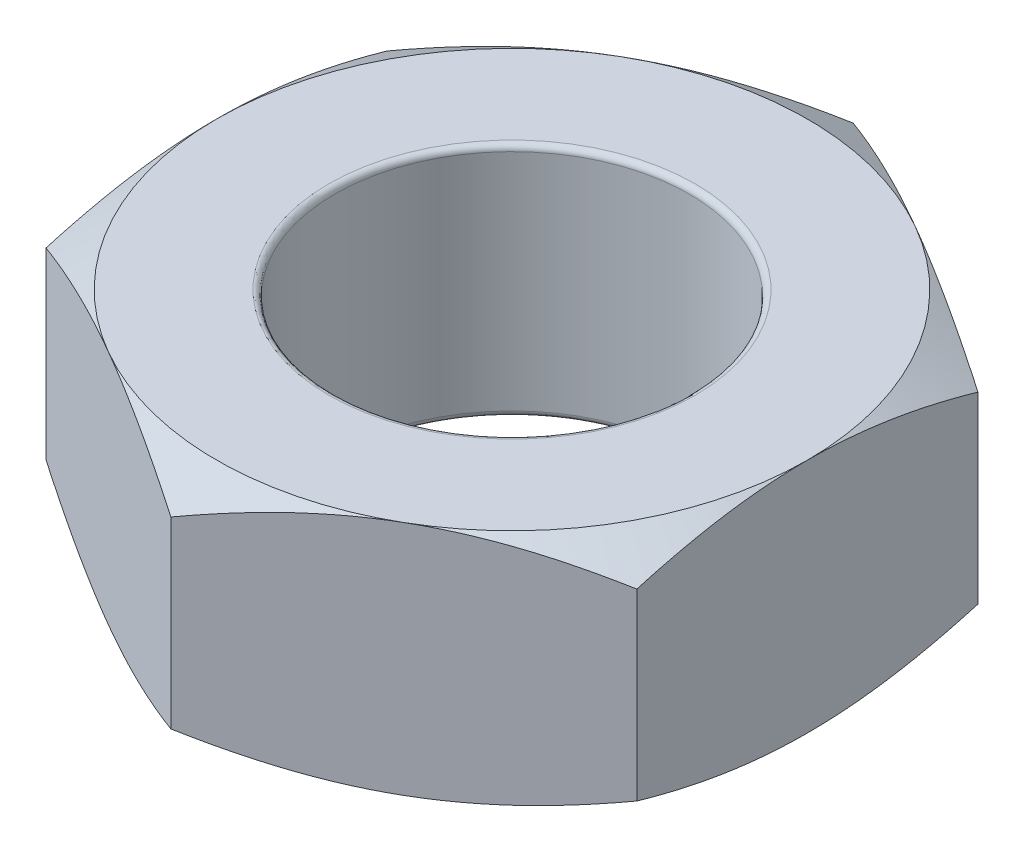
ISO-10303-21;
HEADER;
FILE_DESCRIPTION(('STEP AP214'),'2;1');
FILE_NAME('part.step','',(''),(''),'','','');
FILE_SCHEMA(('AUTOMOTIVE_DESIGN { 1 0 10303 214 1 1 1 1 }'));
ENDSEC;
DATA;
#1=APPLICATION_CONTEXT('core data for automotive mechanical design processes');
#2=APPLICATION_PROTOCOL_DEFINITION('international standard','automotive_design',2000,#1);
#3=PRODUCT_CONTEXT('',#1,'mechanical');
#4=PRODUCT('Part','Part','',(#3));
#5=PRODUCT_RELATED_PRODUCT_CATEGORY('part','',(#4));
#6=PRODUCT_DEFINITION_FORMATION('','',#4);
#7=PRODUCT_DEFINITION_CONTEXT('part definition',#1,'design');
#8=PRODUCT_DEFINITION('design','',#6,#7);
#9=PRODUCT_DEFINITION_SHAPE('','',#8);
#10=(LENGTH_UNIT() NAMED_UNIT(*) SI_UNIT(.MILLI.,.METRE.));
#11=(NAMED_UNIT(*) PLANE_ANGLE_UNIT() SI_UNIT($,.RADIAN.));
#12=(NAMED_UNIT(*) SI_UNIT($,.STERADIAN.) SOLID_ANGLE_UNIT());
#13=UNCERTAINTY_MEASURE_WITH_UNIT(LENGTH_MEASURE(1.E-05),#10,'distance_accuracy_value','');
#14=(GEOMETRIC_REPRESENTATION_CONTEXT(3) GLOBAL_UNCERTAINTY_ASSIGNED_CONTEXT((#13)) GLOBAL_UNIT_ASSIGNED_CONTEXT((#10,
#11,#12)) REPRESENTATION_CONTEXT('',''));
#15=CARTESIAN_POINT('',(0.,0.,0.));
#16=DIRECTION('',(0.,0.,1.));
#17=DIRECTION('',(1.,0.,0.));
#18=AXIS2_PLACEMENT_3D('',#15,#16,#17);
#19=CARTESIAN_POINT('',(2.5,2.,-1.44337567297407));
#20=DIRECTION('',(-0.5,0.,0.866025403784439));
#21=DIRECTION('',(0.866025403784439,0.,0.5));
#22=AXIS2_PLACEMENT_3D('',#19,#20,#21);
#23=PLANE('',#22);
#24=CARTESIAN_POINT('',(-0.000200000000000972,0.223357664359108,-2.88686681600197));
#25=CARTESIAN_POINT('',(0.10966323473487,0.186721620107626,-2.82343724785375));
#26=CARTESIAN_POINT('',(0.220474799896525,0.153402218965056,-2.75946016087834));
#27=CARTESIAN_POINT('',(0.444016833466049,0.0952422855578577,-2.63039810762178));
#28=CARTESIAN_POINT('',(0.556751274528388,0.0704223291477383,-2.5653108477275));
#29=CARTESIAN_POINT('',(0.780822993875268,0.0317856514410521,-2.43594298024479));
#30=CARTESIAN_POINT('',(0.892125791767376,0.017711796185639,-2.37168227992023));
#31=CARTESIAN_POINT('',(1.11525522746833,0.000909152352750347,-2.24285844015415));
#32=CARTESIAN_POINT('',(1.22708105401423,-0.00183354879637327,-2.17829576909553));
#33=CARTESIAN_POINT('',(1.43604197555152,0.00386576000805357,-2.05765212479586));
#34=CARTESIAN_POINT('',(1.53320831755773,0.0109083943818617,-2.0015531110824));
#35=CARTESIAN_POINT('',(1.726907949711,0.0332314191249425,-1.88972057631678));
#36=CARTESIAN_POINT('',(1.82344056965973,0.0485194384402671,-1.8339874422038));
#37=CARTESIAN_POINT('',(2.01753972174048,0.0867390938444202,-1.7219242445005));
#38=CARTESIAN_POINT('',(2.11508168178214,0.109832776125517,-1.66560836761317));
#39=CARTESIAN_POINT('',(2.30871060807608,0.162246656577913,-1.55381665489446));
#40=CARTESIAN_POINT('',(2.40480005588618,0.191554535624548,-1.49833938633502));
#41=CARTESIAN_POINT('',(2.5002,0.223357664359108,-1.44326020292023));
#42=B_SPLINE_CURVE_WITH_KNOTS('',3,(#24,#25,#26,#27,#28,#29,#30,#31,#32,#33,#34,#35,#36,#37,#38,
#39,#40,#41),.UNSPECIFIED.,.F.,.F.,(4,2,2,2,2,2,2,2,4),(0.,0.396285827362227,0.793524330152051,
1.18093086852114,1.56786160134475,1.90479741793733,2.24204551660463,2.58677531536756,
2.93082800105256),.UNSPECIFIED.);
#43=CARTESIAN_POINT('',(0.,0.223290993692601,-2.88675134594813));
#44=VERTEX_POINT('',#43);
#45=CARTESIAN_POINT('',(1.25,0.,-2.1650635094611));
#46=VERTEX_POINT('',#45);
#47=EDGE_CURVE('E63',#44,#46,#42,.T.);
#48=ORIENTED_EDGE('',*,*,#47,.F.);
#49=DIRECTION('',(0.,-1.,0.));
#50=VECTOR('',#49,1.);
#51=CARTESIAN_POINT('',(0.,2.,-2.88675134594813));
#52=LINE('',#51,#50);
#53=CARTESIAN_POINT('',(0.,1.7767090063074,-2.88675134594813));
#54=VERTEX_POINT('',#53);
#55=EDGE_CURVE('E346',#54,#44,#52,.T.);
#56=ORIENTED_EDGE('',*,*,#55,.F.);
#57=CARTESIAN_POINT('',(2.5002,1.77664233564089,-1.44326020292023));
#58=CARTESIAN_POINT('',(2.39033676526513,1.81327837989237,-1.50668977106845));
#59=CARTESIAN_POINT('',(2.27952520010347,1.84659778103494,-1.57066685804385));
#60=CARTESIAN_POINT('',(2.05598316653395,1.90475771444214,-1.69972891130041));
#61=CARTESIAN_POINT('',(1.94324872547161,1.92957767085226,-1.7648161711947));
#62=CARTESIAN_POINT('',(1.71917700612473,1.96821434855895,-1.8941840386774));
#63=CARTESIAN_POINT('',(1.60787420823262,1.98228820381436,-1.95844473900197));
#64=CARTESIAN_POINT('',(1.38474477253167,1.99909084764725,-2.08726857876805));
#65=CARTESIAN_POINT('',(1.27291894598577,2.00183354879637,-2.15183124982667));
#66=CARTESIAN_POINT('',(1.06395802444848,1.99613423999195,-2.27247489412634));
#67=CARTESIAN_POINT('',(0.966791682442268,1.98909160561814,-2.32857390783979));
#68=CARTESIAN_POINT('',(0.773092050288997,1.96676858087506,-2.44040644260542));
#69=CARTESIAN_POINT('',(0.676559430340267,1.95148056155973,-2.4961395767184));
#70=CARTESIAN_POINT('',(0.482460278259523,1.91326090615558,-2.60820277442169));
#71=CARTESIAN_POINT('',(0.384918318217859,1.89016722387448,-2.66451865130903));
#72=CARTESIAN_POINT('',(0.191289391923914,1.83775334342209,-2.77631036402774));
#73=CARTESIAN_POINT('',(0.0951999441138233,1.80844546437545,-2.83178763258718));
#74=CARTESIAN_POINT('',(-0.000200000000001035,1.77664233564089,-2.88686681600197));
#75=B_SPLINE_CURVE_WITH_KNOTS('',3,(#57,#58,#59,#60,#61,#62,#63,#64,#65,#66,#67,#68,#69,#70,#71,
#72,#73,#74),.UNSPECIFIED.,.F.,.F.,(4,2,2,2,2,2,2,2,4),(0.,0.396285827362227,0.793524330152051,
1.18093086852114,1.56786160134475,1.90479741793733,2.24204551660463,2.58677531536756,
2.93082800105256),.UNSPECIFIED.);
#76=CARTESIAN_POINT('',(1.25,2.,-2.1650635094611));
#77=VERTEX_POINT('',#76);
#78=EDGE_CURVE('E278',#77,#54,#75,.T.);
#79=ORIENTED_EDGE('',*,*,#78,.F.);
#80=CARTESIAN_POINT('',(2.5,1.7767090063074,-1.44337567297408));
#81=VERTEX_POINT('',#80);
#82=EDGE_CURVE('E365',#81,#77,#75,.T.);
#83=ORIENTED_EDGE('',*,*,#82,.F.);
#84=DIRECTION('',(0.,-1.,0.));
#85=VECTOR('',#84,1.);
#86=CARTESIAN_POINT('',(2.5,2.,-1.44337567297407));
#87=LINE('',#86,#85);
#88=CARTESIAN_POINT('',(2.5,0.223290993692601,-1.44337567297407));
#89=VERTEX_POINT('',#88);
#90=EDGE_CURVE('E362',#81,#89,#87,.T.);
#91=ORIENTED_EDGE('',*,*,#90,.T.);
#92=EDGE_CURVE('E151',#46,#89,#42,.T.);
#93=ORIENTED_EDGE('',*,*,#92,.F.);
#94=EDGE_LOOP('',(#48,#56,#79,#83,#91,#93));
#95=FACE_BOUND('',#94,.T.);
#96=ADVANCED_FACE('F47',(#95),#23,.F.);
#97=CARTESIAN_POINT('',(0.,2.,-2.88675134594813));
#98=DIRECTION('',(0.5,0.,0.866025403784439));
#99=DIRECTION('',(0.866025403784439,0.,-0.5));
#100=AXIS2_PLACEMENT_3D('',#97,#98,#99);
#101=PLANE('',#100);
#102=CARTESIAN_POINT('',(-2.5002,0.223357664359108,-1.44326020292023));
#103=CARTESIAN_POINT('',(-2.39033676526513,0.186721620107626,-1.50668977106845));
#104=CARTESIAN_POINT('',(-2.27952520010347,0.153402218965056,-1.57066685804385));
#105=CARTESIAN_POINT('',(-2.05598316653395,0.0952422855578577,-1.69972891130041));
#106=CARTESIAN_POINT('',(-1.94324872547161,0.0704223291477382,-1.7648161711947));
#107=CARTESIAN_POINT('',(-1.71917700612473,0.031785651441052,-1.8941840386774));
#108=CARTESIAN_POINT('',(-1.60787420823262,0.0177117961856391,-1.95844473900197));
#109=CARTESIAN_POINT('',(-1.38474477253167,0.000909152352750374,-2.08726857876804));
#110=CARTESIAN_POINT('',(-1.27291894598577,-0.00183354879637335,-2.15183124982667));
#111=CARTESIAN_POINT('',(-1.06395802444848,0.00386576000805362,-2.27247489412634));
#112=CARTESIAN_POINT('',(-0.966791682442269,0.0109083943818619,-2.32857390783979));
#113=CARTESIAN_POINT('',(-0.773092050288998,0.0332314191249427,-2.44040644260542));
#114=CARTESIAN_POINT('',(-0.676559430340268,0.0485194384402672,-2.4961395767184));
#115=CARTESIAN_POINT('',(-0.482460278259525,0.0867390938444203,-2.60820277442169));
#116=CARTESIAN_POINT('',(-0.38491831821786,0.109832776125517,-2.66451865130903));
#117=CARTESIAN_POINT('',(-0.191289391923916,0.162246656577913,-2.77631036402774));
#118=CARTESIAN_POINT('',(-0.0951999441138251,0.191554535624548,-2.83178763258718));
#119=CARTESIAN_POINT('',(0.000199999999998792,0.223357664359108,-2.88686681600197));
#120=B_SPLINE_CURVE_WITH_KNOTS('',3,(#102,#103,#104,#105,#106,#107,#108,#109,#110,#111,#112,
#113,#114,#115,#116,#117,#118,#119),.UNSPECIFIED.,.F.,.F.,(4,2,2,2,2,2,2,2,4),(0.,
0.396285827362227,0.793524330152051,1.18093086852114,1.56786160134475,1.90479741793733,
2.24204551660463,2.58677531536756,2.93082800105256),.UNSPECIFIED.);
#121=CARTESIAN_POINT('',(-2.5,0.223290993692601,-1.44337567297406));
#122=VERTEX_POINT('',#121);
#123=CARTESIAN_POINT('',(-1.25,0.,-2.1650635094611));
#124=VERTEX_POINT('',#123);
#125=EDGE_CURVE('E71',#122,#124,#120,.T.);
#126=ORIENTED_EDGE('',*,*,#125,.F.);
#127=DIRECTION('',(0.,-1.,0.));
#128=VECTOR('',#127,1.);
#129=CARTESIAN_POINT('',(-2.5,2.,-1.44337567297406));
#130=LINE('',#129,#128);
#131=CARTESIAN_POINT('',(-2.5,1.7767090063074,-1.44337567297406));
#132=VERTEX_POINT('',#131);
#133=EDGE_CURVE('E350',#132,#122,#130,.T.);
#134=ORIENTED_EDGE('',*,*,#133,.F.);
#135=CARTESIAN_POINT('',(0.000199999999999193,1.77664233564089,-2.88686681600197));
#136=CARTESIAN_POINT('',(-0.109663234734872,1.81327837989237,-2.82343724785375));
#137=CARTESIAN_POINT('',(-0.220474799896526,1.84659778103494,-2.75946016087834));
#138=CARTESIAN_POINT('',(-0.44401683346605,1.90475771444214,-2.63039810762178));
#139=CARTESIAN_POINT('',(-0.556751274528389,1.92957767085226,-2.5653108477275));
#140=CARTESIAN_POINT('',(-0.780822993875269,1.96821434855895,-2.43594298024479));
#141=CARTESIAN_POINT('',(-0.892125791767378,1.98228820381436,-2.37168227992023));
#142=CARTESIAN_POINT('',(-1.11525522746833,1.99909084764725,-2.24285844015415));
#143=CARTESIAN_POINT('',(-1.22708105401423,2.00183354879637,-2.17829576909553));
#144=CARTESIAN_POINT('',(-1.43604197555152,1.99613423999195,-2.05765212479586));
#145=CARTESIAN_POINT('',(-1.53320831755773,1.98909160561814,-2.0015531110824));
#146=CARTESIAN_POINT('',(-1.726907949711,1.96676858087506,-1.88972057631678));
#147=CARTESIAN_POINT('',(-1.82344056965973,1.95148056155973,-1.8339874422038));
#148=CARTESIAN_POINT('',(-2.01753972174048,1.91326090615558,-1.7219242445005));
#149=CARTESIAN_POINT('',(-2.11508168178214,1.89016722387448,-1.66560836761316));
#150=CARTESIAN_POINT('',(-2.30871060807609,1.83775334342209,-1.55381665489446));
#151=CARTESIAN_POINT('',(-2.40480005588618,1.80844546437545,-1.49833938633502));
#152=CARTESIAN_POINT('',(-2.5002,1.77664233564089,-1.44326020292023));
#153=B_SPLINE_CURVE_WITH_KNOTS('',3,(#135,#136,#137,#138,#139,#140,#141,#142,#143,#144,#145,
#146,#147,#148,#149,#150,#151,#152),.UNSPECIFIED.,.F.,.F.,(4,2,2,2,2,2,2,2,4),(0.,
0.396285827362227,0.793524330152051,1.18093086852114,1.56786160134475,1.90479741793733,
2.24204551660463,2.58677531536756,2.93082800105256),.UNSPECIFIED.);
#154=CARTESIAN_POINT('',(-1.25,2.,-2.1650635094611));
#155=VERTEX_POINT('',#154);
#156=EDGE_CURVE('E270',#155,#132,#153,.T.);
#157=ORIENTED_EDGE('',*,*,#156,.F.);
#158=EDGE_CURVE('E277',#54,#155,#153,.T.);
#159=ORIENTED_EDGE('',*,*,#158,.F.);
#160=ORIENTED_EDGE('',*,*,#55,.T.);
#161=EDGE_CURVE('E183',#124,#44,#120,.T.);
#162=ORIENTED_EDGE('',*,*,#161,.F.);
#163=EDGE_LOOP('',(#126,#134,#157,#159,#160,#162));
#164=FACE_BOUND('',#163,.T.);
#165=ADVANCED_FACE('F284',(#164),#101,.F.);
#166=CARTESIAN_POINT('',(-2.5,2.,-1.44337567297406));
#167=DIRECTION('',(1.,0.,0.));
#168=DIRECTION('',(0.,0.,-1.));
#169=AXIS2_PLACEMENT_3D('',#166,#167,#168);
#170=PLANE('',#169);
#171=CARTESIAN_POINT('',(-2.5,1.75051746805577,4.93486171933444));
#172=CARTESIAN_POINT('',(-2.5,1.69133726261722,4.8199403481942));
#173=CARTESIAN_POINT('',(-2.5,1.63247825676005,4.70485212642124));
#174=CARTESIAN_POINT('',(-2.5,1.51556406119456,4.47426567976795));
#175=CARTESIAN_POINT('',(-2.5,1.45750888635444,4.3587674473533));
#176=CARTESIAN_POINT('',(-2.5,1.34227244134488,4.12710089531368));
#177=CARTESIAN_POINT('',(-2.5,1.28509274407798,4.01093179192169));
#178=CARTESIAN_POINT('',(-2.5,1.17192590701674,3.77801122649482));
#179=CARTESIAN_POINT('',(-2.5,1.11593878415348,3.66125975622101));
#180=CARTESIAN_POINT('',(-2.5,1.00253157682963,3.42088300849687));
#181=CARTESIAN_POINT('',(-2.5,0.945191561608959,3.2972198482005));
#182=CARTESIAN_POINT('',(-2.5,0.832598686179216,3.04894788037271));
#183=CARTESIAN_POINT('',(-2.5,0.777345769924556,2.92433909834247));
#184=CARTESIAN_POINT('',(-2.5,0.669564709168184,2.67404231382757));
#185=CARTESIAN_POINT('',(-2.5,0.617034744165751,2.54835509963059));
#186=CARTESIAN_POINT('',(-2.5,0.515470603951829,2.29553518807958));
#187=CARTESIAN_POINT('',(-2.5,0.466437240853758,2.16840216282304));
#188=CARTESIAN_POINT('',(-2.5,0.36551904558916,1.89196933857389));
#189=CARTESIAN_POINT('',(-2.5,0.314430928565565,1.74237414052598));
#190=CARTESIAN_POINT('',(-2.5,0.220856049236355,1.4405551511059));
#191=CARTESIAN_POINT('',(-2.5,0.178364945289853,1.28833272889575));
#192=CARTESIAN_POINT('',(-2.5,0.105752289587979,0.983942199808397));
#193=CARTESIAN_POINT('',(-2.5,0.075408967281811,0.831829132495784));
#194=CARTESIAN_POINT('',(-2.5,0.0406516796303217,0.602071425625844));
#195=CARTESIAN_POINT('',(-2.5,0.0308592992319912,0.525228449493818));
#196=CARTESIAN_POINT('',(-2.5,0.0151636656794685,0.371150643177173));
#197=CARTESIAN_POINT('',(-2.5,0.00925981943211505,0.293915874561849));
#198=CARTESIAN_POINT('',(-2.5,0.00149945618362679,0.13817730801555));
#199=CARTESIAN_POINT('',(-2.5,-0.000300329680072579,0.0596706558577329));
#200=CARTESIAN_POINT('',(-2.5,0.000382182470508818,-0.0973237037747563));
#201=CARTESIAN_POINT('',(-2.5,0.00286448024898971,-0.175811411250471));
#202=CARTESIAN_POINT('',(-2.5,0.0120180751018743,-0.33255646239666));
#203=CARTESIAN_POINT('',(-2.5,0.0186902391546219,-0.4108137550211));
#204=CARTESIAN_POINT('',(-2.5,0.0359818737124383,-0.566895759516455));
#205=CARTESIAN_POINT('',(-2.5,0.0466019878865535,-0.644720398746936));
#206=CARTESIAN_POINT('',(-2.5,0.0843776540425921,-0.880425277323258));
#207=CARTESIAN_POINT('',(-2.5,0.117244290445989,-1.0374021276822));
#208=CARTESIAN_POINT('',(-2.5,0.194551132550417,-1.34841101742391));
#209=CARTESIAN_POINT('',(-2.5,0.238994974726619,-1.50244211517955));
#210=CARTESIAN_POINT('',(-2.5,0.334467726657707,-1.80198948227857));
#211=CARTESIAN_POINT('',(-2.5,0.385183371784437,-1.94760725909514));
#212=CARTESIAN_POINT('',(-2.5,0.492317846941426,-2.23674360042291));
#213=CARTESIAN_POINT('',(-2.5,0.548738075330582,-2.38026164031034));
#214=CARTESIAN_POINT('',(-2.5,0.665809108984892,-2.66572180096044));
#215=CARTESIAN_POINT('',(-2.5,0.726464237701915,-2.80766213451906));
#216=CARTESIAN_POINT('',(-2.5,0.850881769521233,-3.0901760741915));
#217=CARTESIAN_POINT('',(-2.5,0.914644342755144,-3.23074960496675));
#218=CARTESIAN_POINT('',(-2.5,1.04081855009125,-3.50283338488747));
#219=CARTESIAN_POINT('',(-2.5,1.10310046173394,-3.63440403331771));
#220=CARTESIAN_POINT('',(-2.5,1.2292955254876,-3.89676431270018));
#221=CARTESIAN_POINT('',(-2.5,1.29320873128699,-4.02755391777179));
#222=CARTESIAN_POINT('',(-2.5,1.42210820195559,-4.28806433847913));
#223=CARTESIAN_POINT('',(-2.5,1.48709022600769,-4.41778725733018));
#224=CARTESIAN_POINT('',(-2.5,1.61808743263322,-4.67669676330922));
#225=CARTESIAN_POINT('',(-2.5,1.68410252583257,-4.8058833956229));
#226=CARTESIAN_POINT('',(-2.5,1.75051746805577,-4.93486171933444));
#227=B_SPLINE_CURVE_WITH_KNOTS('',3,(#171,#172,#173,#174,#175,#176,#177,#178,#179,#180,#181,
#182,#183,#184,#185,#186,#187,#188,#189,#190,#191,#192,#193,#194,#195,#196,#197,#198,#199,#200,
#201,#202,#203,#204,#205,#206,#207,#208,#209,#210,#211,#212,#213,#214,#215,#216,#217,#218,#219,
#220,#221,#222,#223,#224,#225,#226),.UNSPECIFIED.,.F.,.F.,(4,2,2,2,2,2,2,2,2,2,2,2,2,2,2,2,2,2,
2,2,2,2,2,2,2,2,2,4),(0.,0.387793831894925,0.775594827128252,1.16402581850153,1.5524623207934,
1.96137758264064,2.37028185592793,2.77890912291195,3.1876309897647,3.66167496284643,
4.13547893462243,4.60018855861608,4.83249783003166,5.06477166059454,5.30023727903514,
5.53570288450944,5.77121722921933,6.00676998875775,6.48725754661897,6.96789621109928,
7.43032586595214,7.89286915182353,8.35589175957824,8.81893974621792,9.25562834373433,
9.69233133192937,10.1275921173417,10.5628154528867),.UNSPECIFIED.);
#228=CARTESIAN_POINT('',(-2.5,0.223290993692601,1.44337567297407));
#229=VERTEX_POINT('',#228);
#230=CARTESIAN_POINT('',(-2.5,0.,0.));
#231=VERTEX_POINT('',#230);
#232=EDGE_CURVE('E404',#229,#231,#227,.T.);
#233=ORIENTED_EDGE('',*,*,#232,.F.);
#234=DIRECTION('',(0.,-1.,0.));
#235=VECTOR('',#234,1.);
#236=CARTESIAN_POINT('',(-2.5,2.,1.44337567297407));
#237=LINE('',#236,#235);
#238=CARTESIAN_POINT('',(-2.5,1.7767090063074,1.44337567297407));
#239=VERTEX_POINT('',#238);
#240=EDGE_CURVE('E354',#239,#229,#237,.T.);
#241=ORIENTED_EDGE('',*,*,#240,.F.);
#242=CARTESIAN_POINT('',(-2.5,0.249482531944228,-4.93486171933444));
#243=CARTESIAN_POINT('',(-2.5,0.308662737382781,-4.8199403481942));
#244=CARTESIAN_POINT('',(-2.5,0.36752174323995,-4.70485212642124));
#245=CARTESIAN_POINT('',(-2.5,0.48443593880544,-4.47426567976795));
#246=CARTESIAN_POINT('',(-2.5,0.542491113645564,-4.3587674473533));
#247=CARTESIAN_POINT('',(-2.5,0.657727558655123,-4.12710089531368));
#248=CARTESIAN_POINT('',(-2.5,0.714907255922023,-4.01093179192169));
#249=CARTESIAN_POINT('',(-2.5,0.828074092983264,-3.77801122649482));
#250=CARTESIAN_POINT('',(-2.5,0.884061215846521,-3.66125975622101));
#251=CARTESIAN_POINT('',(-2.5,0.997468423170368,-3.42088300849687));
#252=CARTESIAN_POINT('',(-2.5,1.05480843839104,-3.2972198482005));
#253=CARTESIAN_POINT('',(-2.5,1.16740131382078,-3.04894788037271));
#254=CARTESIAN_POINT('',(-2.5,1.22265423007544,-2.92433909834247));
#255=CARTESIAN_POINT('',(-2.5,1.33043529083182,-2.67404231382757));
#256=CARTESIAN_POINT('',(-2.5,1.38296525583425,-2.54835509963059));
#257=CARTESIAN_POINT('',(-2.5,1.48452939604817,-2.29553518807957));
#258=CARTESIAN_POINT('',(-2.5,1.53356275914624,-2.16840216282304));
#259=CARTESIAN_POINT('',(-2.5,1.63448095441084,-1.89196933857388));
#260=CARTESIAN_POINT('',(-2.5,1.68556907143444,-1.74237414052597));
#261=CARTESIAN_POINT('',(-2.5,1.77914395076365,-1.4405551511059));
#262=CARTESIAN_POINT('',(-2.5,1.82163505471015,-1.28833272889575));
#263=CARTESIAN_POINT('',(-2.5,1.89424771041202,-0.983942199808394));
#264=CARTESIAN_POINT('',(-2.5,1.92459103271819,-0.831829132495781));
#265=CARTESIAN_POINT('',(-2.5,1.95934832036968,-0.602071425625841));
#266=CARTESIAN_POINT('',(-2.5,1.96914070076801,-0.525228449493815));
#267=CARTESIAN_POINT('',(-2.5,1.98483633432053,-0.371150643177171));
#268=CARTESIAN_POINT('',(-2.5,1.99074018056788,-0.293915874561847));
#269=CARTESIAN_POINT('',(-2.5,1.99850054381637,-0.138177308015548));
#270=CARTESIAN_POINT('',(-2.5,2.00030032968007,-0.0596706558577308));
#271=CARTESIAN_POINT('',(-2.5,1.99961781752949,0.0973237037747584));
#272=CARTESIAN_POINT('',(-2.5,1.99713551975101,0.175811411250473));
#273=CARTESIAN_POINT('',(-2.5,1.98798192489813,0.332556462396662));
#274=CARTESIAN_POINT('',(-2.5,1.98130976084538,0.410813755021102));
#275=CARTESIAN_POINT('',(-2.5,1.96401812628756,0.566895759516457));
#276=CARTESIAN_POINT('',(-2.5,1.95339801211345,0.644720398746938));
#277=CARTESIAN_POINT('',(-2.5,1.91562234595741,0.880425277323259));
#278=CARTESIAN_POINT('',(-2.5,1.88275570955401,1.0374021276822));
#279=CARTESIAN_POINT('',(-2.5,1.80544886744958,1.34841101742391));
#280=CARTESIAN_POINT('',(-2.5,1.76100502527338,1.50244211517955));
#281=CARTESIAN_POINT('',(-2.5,1.66553227334229,1.80198948227857));
#282=CARTESIAN_POINT('',(-2.5,1.61481662821556,1.94760725909515));
#283=CARTESIAN_POINT('',(-2.5,1.50768215305858,2.23674360042291));
#284=CARTESIAN_POINT('',(-2.5,1.45126192466942,2.38026164031034));
#285=CARTESIAN_POINT('',(-2.5,1.33419089101511,2.66572180096044));
#286=CARTESIAN_POINT('',(-2.5,1.27353576229809,2.80766213451906));
#287=CARTESIAN_POINT('',(-2.5,1.14911823047877,3.0901760741915));
#288=CARTESIAN_POINT('',(-2.5,1.08535565724486,3.23074960496675));
#289=CARTESIAN_POINT('',(-2.5,0.959181449908747,3.50283338488747));
#290=CARTESIAN_POINT('',(-2.5,0.896899538266062,3.63440403331771));
#291=CARTESIAN_POINT('',(-2.5,0.770704474512404,3.89676431270018));
#292=CARTESIAN_POINT('',(-2.5,0.70679126871301,4.02755391777178));
#293=CARTESIAN_POINT('',(-2.5,0.577891798044411,4.28806433847913));
#294=CARTESIAN_POINT('',(-2.5,0.512909773992309,4.41778725733018));
#295=CARTESIAN_POINT('',(-2.5,0.381912567366776,4.67669676330922));
#296=CARTESIAN_POINT('',(-2.5,0.315897474167429,4.8058833956229));
#297=CARTESIAN_POINT('',(-2.5,0.249482531944229,4.93486171933444));
#298=B_SPLINE_CURVE_WITH_KNOTS('',3,(#242,#243,#244,#245,#246,#247,#248,#249,#250,#251,#252,
#253,#254,#255,#256,#257,#258,#259,#260,#261,#262,#263,#264,#265,#266,#267,#268,#269,#270,#271,
#272,#273,#274,#275,#276,#277,#278,#279,#280,#281,#282,#283,#284,#285,#286,#287,#288,#289,#290,
#291,#292,#293,#294,#295,#296,#297),.UNSPECIFIED.,.F.,.F.,(4,2,2,2,2,2,2,2,2,2,2,2,2,2,2,2,2,2,
2,2,2,2,2,2,2,2,2,4),(0.,0.387793831894924,0.775594827128251,1.16402581850153,1.5524623207934,
1.96137758264064,2.37028185592793,2.77890912291195,3.1876309897647,3.66167496284643,
4.13547893462244,4.60018855861608,4.83249783003166,5.06477166059454,5.30023727903514,
5.53570288450945,5.77121722921934,6.00676998875775,6.48725754661897,6.96789621109928,
7.43032586595214,7.89286915182353,8.35589175957824,8.81893974621792,9.25562834373433,
9.69233133192937,10.1275921173417,10.5628154528867),.UNSPECIFIED.);
#299=CARTESIAN_POINT('',(-2.5,2.,0.));
#300=VERTEX_POINT('',#299);
#301=EDGE_CURVE('E262',#300,#239,#298,.T.);
#302=ORIENTED_EDGE('',*,*,#301,.F.);
#303=EDGE_CURVE('E269',#132,#300,#298,.T.);
#304=ORIENTED_EDGE('',*,*,#303,.F.);
#305=ORIENTED_EDGE('',*,*,#133,.T.);
#306=EDGE_CURVE('E219',#231,#122,#227,.T.);
#307=ORIENTED_EDGE('',*,*,#306,.F.);
#308=EDGE_LOOP('',(#233,#241,#302,#304,#305,#307));
#309=FACE_BOUND('',#308,.T.);
#310=ADVANCED_FACE('F242',(#309),#170,.F.);
#311=CARTESIAN_POINT('',(-2.5,2.,1.44337567297407));
#312=DIRECTION('',(0.5,0.,-0.866025403784439));
#313=DIRECTION('',(-0.866025403784439,0.,-0.5));
#314=AXIS2_PLACEMENT_3D('',#311,#312,#313);
#315=PLANE('',#314);
#316=CARTESIAN_POINT('',(0.000200000000000356,0.223357664359108,2.88686681600197));
#317=CARTESIAN_POINT('',(-0.109663234734871,0.186721620107625,2.82343724785375));
#318=CARTESIAN_POINT('',(-0.220474799896525,0.153402218965056,2.75946016087834));
#319=CARTESIAN_POINT('',(-0.44401683346605,0.0952422855578575,2.63039810762178));
#320=CARTESIAN_POINT('',(-0.556751274528388,0.0704223291477381,2.5653108477275));
#321=CARTESIAN_POINT('',(-0.780822993875268,0.0317856514410518,2.43594298024479));
#322=CARTESIAN_POINT('',(-0.892125791767376,0.0177117961856387,2.37168227992023));
#323=CARTESIAN_POINT('',(-1.11525522746833,0.000909152352750135,2.24285844015415));
#324=CARTESIAN_POINT('',(-1.22708105401423,-0.00183354879637336,2.17829576909553));
#325=CARTESIAN_POINT('',(-1.43604197555152,0.00386576000805353,2.05765212479586));
#326=CARTESIAN_POINT('',(-1.53320831755773,0.0109083943818616,2.0015531110824));
#327=CARTESIAN_POINT('',(-1.726907949711,0.0332314191249423,1.88972057631678));
#328=CARTESIAN_POINT('',(-1.82344056965973,0.0485194384402669,1.8339874422038));
#329=CARTESIAN_POINT('',(-2.01753972174048,0.08673909384442,1.7219242445005));
#330=CARTESIAN_POINT('',(-2.11508168178214,0.109832776125517,1.66560836761316));
#331=CARTESIAN_POINT('',(-2.30871060807608,0.162246656577912,1.55381665489446));
#332=CARTESIAN_POINT('',(-2.40480005588618,0.191554535624548,1.49833938633502));
#333=CARTESIAN_POINT('',(-2.5002,0.223357664359108,1.44326020292023));
#334=B_SPLINE_CURVE_WITH_KNOTS('',3,(#316,#317,#318,#319,#320,#321,#322,#323,#324,#325,#326,
#327,#328,#329,#330,#331,#332,#333),.UNSPECIFIED.,.F.,.F.,(4,2,2,2,2,2,2,2,4),(0.,
0.396285827362227,0.793524330152051,1.18093086852114,1.56786160134475,1.90479741793733,
2.24204551660463,2.58677531536756,2.93082800105256),.UNSPECIFIED.);
#335=CARTESIAN_POINT('',(0.,0.223290993692601,2.88675134594813));
#336=VERTEX_POINT('',#335);
#337=CARTESIAN_POINT('',(-1.25,0.,2.1650635094611));
#338=VERTEX_POINT('',#337);
#339=EDGE_CURVE('E161',#336,#338,#334,.T.);
#340=ORIENTED_EDGE('',*,*,#339,.F.);
#341=DIRECTION('',(0.,-1.,0.));
#342=VECTOR('',#341,1.);
#343=CARTESIAN_POINT('',(0.,2.,2.88675134594813));
#344=LINE('',#343,#342);
#345=CARTESIAN_POINT('',(0.,1.7767090063074,2.88675134594813));
#346=VERTEX_POINT('',#345);
#347=EDGE_CURVE('E179',#346,#336,#344,.T.);
#348=ORIENTED_EDGE('',*,*,#347,.F.);
#349=CARTESIAN_POINT('',(-2.5002,1.77664233564089,1.44326020292023));
#350=CARTESIAN_POINT('',(-2.39033676526513,1.81327837989237,1.50668977106845));
#351=CARTESIAN_POINT('',(-2.27952520010347,1.84659778103494,1.57066685804385));
#352=CARTESIAN_POINT('',(-2.05598316653395,1.90475771444214,1.69972891130041));
#353=CARTESIAN_POINT('',(-1.94324872547161,1.92957767085226,1.7648161711947));
#354=CARTESIAN_POINT('',(-1.71917700612473,1.96821434855895,1.8941840386774));
#355=CARTESIAN_POINT('',(-1.60787420823262,1.98228820381436,1.95844473900197));
#356=CARTESIAN_POINT('',(-1.38474477253167,1.99909084764725,2.08726857876804));
#357=CARTESIAN_POINT('',(-1.27291894598577,2.00183354879637,2.15183124982667));
#358=CARTESIAN_POINT('',(-1.06395802444848,1.99613423999195,2.27247489412634));
#359=CARTESIAN_POINT('',(-0.966791682442269,1.98909160561814,2.32857390783979));
#360=CARTESIAN_POINT('',(-0.773092050288997,1.96676858087506,2.44040644260542));
#361=CARTESIAN_POINT('',(-0.676559430340267,1.95148056155973,2.4961395767184));
#362=CARTESIAN_POINT('',(-0.482460278259524,1.91326090615558,2.60820277442169));
#363=CARTESIAN_POINT('',(-0.384918318217859,1.89016722387448,2.66451865130903));
#364=CARTESIAN_POINT('',(-0.191289391923915,1.83775334342209,2.77631036402774));
#365=CARTESIAN_POINT('',(-0.0951999441138235,1.80844546437545,2.83178763258718));
#366=CARTESIAN_POINT('',(0.000200000000000611,1.77664233564089,2.88686681600197));
#367=B_SPLINE_CURVE_WITH_KNOTS('',3,(#349,#350,#351,#352,#353,#354,#355,#356,#357,#358,#359,
#360,#361,#362,#363,#364,#365,#366),.UNSPECIFIED.,.F.,.F.,(4,2,2,2,2,2,2,2,4),(0.,
0.396285827362226,0.793524330152051,1.18093086852114,1.56786160134475,1.90479741793733,
2.24204551660463,2.58677531536756,2.93082800105256),.UNSPECIFIED.);
#368=CARTESIAN_POINT('',(-1.25,2.,2.1650635094611));
#369=VERTEX_POINT('',#368);
#370=EDGE_CURVE('E247',#369,#346,#367,.T.);
#371=ORIENTED_EDGE('',*,*,#370,.F.);
#372=EDGE_CURVE('E255',#239,#369,#367,.T.);
#373=ORIENTED_EDGE('',*,*,#372,.F.);
#374=ORIENTED_EDGE('',*,*,#240,.T.);
#375=EDGE_CURVE('E185',#338,#229,#334,.T.);
#376=ORIENTED_EDGE('',*,*,#375,.F.);
#377=EDGE_LOOP('',(#340,#348,#371,#373,#374,#376));
#378=FACE_BOUND('',#377,.T.);
#379=ADVANCED_FACE('F239',(#378),#315,.F.);
#380=CARTESIAN_POINT('',(0.,2.,2.88675134594813));
#381=DIRECTION('',(-0.5,0.,-0.866025403784439));
#382=DIRECTION('',(-0.866025403784439,0.,0.5));
#383=AXIS2_PLACEMENT_3D('',#380,#381,#382);
#384=PLANE('',#383);
#385=CARTESIAN_POINT('',(2.5002,0.223357664359108,1.44326020292023));
#386=CARTESIAN_POINT('',(2.39033676526513,0.186721620107626,1.50668977106845));
#387=CARTESIAN_POINT('',(2.27952520010347,0.153402218965056,1.57066685804385));
#388=CARTESIAN_POINT('',(2.05598316653395,0.0952422855578576,1.69972891130041));
#389=CARTESIAN_POINT('',(1.94324872547161,0.0704223291477382,1.7648161711947));
#390=CARTESIAN_POINT('',(1.71917700612473,0.031785651441052,1.8941840386774));
#391=CARTESIAN_POINT('',(1.60787420823262,0.0177117961856389,1.95844473900197));
#392=CARTESIAN_POINT('',(1.38474477253167,0.000909152352750234,2.08726857876804));
#393=CARTESIAN_POINT('',(1.27291894598577,-0.00183354879637335,2.15183124982667));
#394=CARTESIAN_POINT('',(1.06395802444848,0.00386576000805363,2.27247489412634));
#395=CARTESIAN_POINT('',(0.966791682442269,0.0109083943818618,2.32857390783979));
#396=CARTESIAN_POINT('',(0.773092050288997,0.0332314191249426,2.44040644260542));
#397=CARTESIAN_POINT('',(0.676559430340268,0.0485194384402671,2.4961395767184));
#398=CARTESIAN_POINT('',(0.482460278259524,0.0867390938444202,2.60820277442169));
#399=CARTESIAN_POINT('',(0.38491831821786,0.109832776125517,2.66451865130903));
#400=CARTESIAN_POINT('',(0.191289391923915,0.162246656577913,2.77631036402774));
#401=CARTESIAN_POINT('',(0.095199944113824,0.191554535624548,2.83178763258718));
#402=CARTESIAN_POINT('',(-0.000200000000000024,0.223357664359108,2.88686681600197));
#403=B_SPLINE_CURVE_WITH_KNOTS('',3,(#385,#386,#387,#388,#389,#390,#391,#392,#393,#394,#395,
#396,#397,#398,#399,#400,#401,#402),.UNSPECIFIED.,.F.,.F.,(4,2,2,2,2,2,2,2,4),(0.,
0.396285827362227,0.793524330152051,1.18093086852114,1.56786160134475,1.90479741793733,
2.24204551660463,2.58677531536756,2.93082800105256),.UNSPECIFIED.);
#404=CARTESIAN_POINT('',(2.5,0.223290993692595,1.44337567297407));
#405=VERTEX_POINT('',#404);
#406=CARTESIAN_POINT('',(1.25,0.,2.1650635094611));
#407=VERTEX_POINT('',#406);
#408=EDGE_CURVE('E138',#405,#407,#403,.T.);
#409=ORIENTED_EDGE('',*,*,#408,.F.);
#410=DIRECTION('',(0.,-1.,0.));
#411=VECTOR('',#410,1.);
#412=CARTESIAN_POINT('',(2.5,2.,1.44337567297406));
#413=LINE('',#412,#411);
#414=CARTESIAN_POINT('',(2.5,1.7767090063074,1.44337567297406));
#415=VERTEX_POINT('',#414);
#416=EDGE_CURVE('E360',#415,#405,#413,.T.);
#417=ORIENTED_EDGE('',*,*,#416,.F.);
#418=CARTESIAN_POINT('',(-0.000199999999999823,1.77664233564089,2.88686681600197));
#419=CARTESIAN_POINT('',(0.109663234734871,1.81327837989237,2.82343724785375));
#420=CARTESIAN_POINT('',(0.220474799896526,1.84659778103494,2.75946016087834));
#421=CARTESIAN_POINT('',(0.44401683346605,1.90475771444214,2.63039810762178));
#422=CARTESIAN_POINT('',(0.556751274528388,1.92957767085226,2.5653108477275));
#423=CARTESIAN_POINT('',(0.780822993875269,1.96821434855895,2.43594298024479));
#424=CARTESIAN_POINT('',(0.892125791767377,1.98228820381436,2.37168227992023));
#425=CARTESIAN_POINT('',(1.11525522746833,1.99909084764725,2.24285844015415));
#426=CARTESIAN_POINT('',(1.22708105401423,2.00183354879637,2.17829576909553));
#427=CARTESIAN_POINT('',(1.43604197555152,1.99613423999195,2.05765212479586));
#428=CARTESIAN_POINT('',(1.53320831755773,1.98909160561814,2.0015531110824));
#429=CARTESIAN_POINT('',(1.726907949711,1.96676858087506,1.88972057631678));
#430=CARTESIAN_POINT('',(1.82344056965973,1.95148056155973,1.8339874422038));
#431=CARTESIAN_POINT('',(2.01753972174048,1.91326090615558,1.7219242445005));
#432=CARTESIAN_POINT('',(2.11508168178214,1.89016722387448,1.66560836761316));
#433=CARTESIAN_POINT('',(2.30871060807609,1.83775334342209,1.55381665489446));
#434=CARTESIAN_POINT('',(2.40480005588618,1.80844546437545,1.49833938633502));
#435=CARTESIAN_POINT('',(2.5002,1.77664233564089,1.44326020292023));
#436=B_SPLINE_CURVE_WITH_KNOTS('',3,(#418,#419,#420,#421,#422,#423,#424,#425,#426,#427,#428,
#429,#430,#431,#432,#433,#434,#435),.UNSPECIFIED.,.F.,.F.,(4,2,2,2,2,2,2,2,4),(0.,
0.396285827362227,0.793524330152051,1.18093086852114,1.56786160134475,1.90479741793733,
2.24204551660463,2.58677531536756,2.93082800105256),.UNSPECIFIED.);
#437=CARTESIAN_POINT('',(1.25,2.,2.1650635094611));
#438=VERTEX_POINT('',#437);
#439=EDGE_CURVE('E257',#438,#415,#436,.T.);
#440=ORIENTED_EDGE('',*,*,#439,.F.);
#441=EDGE_CURVE('E256',#346,#438,#436,.T.);
#442=ORIENTED_EDGE('',*,*,#441,.F.);
#443=ORIENTED_EDGE('',*,*,#347,.T.);
#444=EDGE_CURVE('E154',#407,#336,#403,.T.);
#445=ORIENTED_EDGE('',*,*,#444,.F.);
#446=EDGE_LOOP('',(#409,#417,#440,#442,#443,#445));
#447=FACE_BOUND('',#446,.T.);
#448=ADVANCED_FACE('F176',(#447),#384,.F.);
#449=CARTESIAN_POINT('',(2.5,2.,1.44337567297406));
#450=DIRECTION('',(-1.,0.,0.));
#451=DIRECTION('',(0.,0.,1.));
#452=AXIS2_PLACEMENT_3D('',#449,#450,#451);
#453=PLANE('',#452);
#454=CARTESIAN_POINT('',(2.5,1.75051746805577,-4.93486171933444));
#455=CARTESIAN_POINT('',(2.5,1.69133726261722,-4.8199403481942));
#456=CARTESIAN_POINT('',(2.5,1.63247825676005,-4.70485212642124));
#457=CARTESIAN_POINT('',(2.5,1.51556406119456,-4.47426567976795));
#458=CARTESIAN_POINT('',(2.5,1.45750888635444,-4.3587674473533));
#459=CARTESIAN_POINT('',(2.5,1.34227244134488,-4.12710089531368));
#460=CARTESIAN_POINT('',(2.5,1.28509274407798,-4.01093179192169));
#461=CARTESIAN_POINT('',(2.5,1.17192590701674,-3.77801122649482));
#462=CARTESIAN_POINT('',(2.5,1.11593878415348,-3.66125975622101));
#463=CARTESIAN_POINT('',(2.5,1.00253157682963,-3.42088300849687));
#464=CARTESIAN_POINT('',(2.5,0.945191561608959,-3.2972198482005));
#465=CARTESIAN_POINT('',(2.5,0.832598686179216,-3.04894788037271));
#466=CARTESIAN_POINT('',(2.5,0.777345769924556,-2.92433909834247));
#467=CARTESIAN_POINT('',(2.5,0.669564709168184,-2.67404231382757));
#468=CARTESIAN_POINT('',(2.5,0.617034744165751,-2.54835509963059));
#469=CARTESIAN_POINT('',(2.5,0.515470603951828,-2.29553518807958));
#470=CARTESIAN_POINT('',(2.5,0.466437240853758,-2.16840216282304));
#471=CARTESIAN_POINT('',(2.5,0.36551904558916,-1.89196933857389));
#472=CARTESIAN_POINT('',(2.5,0.314430928565565,-1.74237414052598));
#473=CARTESIAN_POINT('',(2.5,0.220856049236354,-1.4405551511059));
#474=CARTESIAN_POINT('',(2.5,0.178364945289853,-1.28833272889575));
#475=CARTESIAN_POINT('',(2.5,0.105752289587979,-0.983942199808396));
#476=CARTESIAN_POINT('',(2.5,0.0754089672818111,-0.831829132495783));
#477=CARTESIAN_POINT('',(2.5,0.0406516796303216,-0.602071425625843));
#478=CARTESIAN_POINT('',(2.5,0.0308592992319909,-0.525228449493817));
#479=CARTESIAN_POINT('',(2.5,0.0151636656794683,-0.371150643177173));
#480=CARTESIAN_POINT('',(2.5,0.00925981943211499,-0.293915874561848));
#481=CARTESIAN_POINT('',(2.5,0.00149945618362683,-0.138177308015549));
#482=CARTESIAN_POINT('',(2.5,-0.000300329680072633,-0.0596706558577315));
#483=CARTESIAN_POINT('',(2.5,0.00038218247050887,0.097323703774758));
#484=CARTESIAN_POINT('',(2.5,0.00286448024898993,0.175811411250473));
#485=CARTESIAN_POINT('',(2.5,0.0120180751018746,0.332556462396662));
#486=CARTESIAN_POINT('',(2.5,0.0186902391546221,0.410813755021102));
#487=CARTESIAN_POINT('',(2.5,0.0359818737124385,0.566895759516458));
#488=CARTESIAN_POINT('',(2.5,0.0466019878865538,0.644720398746937));
#489=CARTESIAN_POINT('',(2.5,0.0843776540425924,0.880425277323259));
#490=CARTESIAN_POINT('',(2.5,0.117244290445989,1.0374021276822));
#491=CARTESIAN_POINT('',(2.5,0.194551132550417,1.34841101742391));
#492=CARTESIAN_POINT('',(2.5,0.238994974726619,1.50244211517955));
#493=CARTESIAN_POINT('',(2.5,0.334467726657707,1.80198948227857));
#494=CARTESIAN_POINT('',(2.5,0.385183371784437,1.94760725909514));
#495=CARTESIAN_POINT('',(2.5,0.492317846941426,2.23674360042291));
#496=CARTESIAN_POINT('',(2.5,0.548738075330582,2.38026164031034));
#497=CARTESIAN_POINT('',(2.5,0.665809108984892,2.66572180096044));
#498=CARTESIAN_POINT('',(2.5,0.726464237701915,2.80766213451906));
#499=CARTESIAN_POINT('',(2.5,0.850881769521233,3.0901760741915));
#500=CARTESIAN_POINT('',(2.5,0.914644342755144,3.23074960496675));
#501=CARTESIAN_POINT('',(2.5,1.04081855009125,3.50283338488746));
#502=CARTESIAN_POINT('',(2.5,1.10310046173394,3.63440403331771));
#503=CARTESIAN_POINT('',(2.5,1.2292955254876,3.89676431270018));
#504=CARTESIAN_POINT('',(2.5,1.29320873128699,4.02755391777178));
#505=CARTESIAN_POINT('',(2.5,1.42210820195559,4.28806433847913));
#506=CARTESIAN_POINT('',(2.5,1.48709022600769,4.41778725733018));
#507=CARTESIAN_POINT('',(2.5,1.61808743263322,4.67669676330922));
#508=CARTESIAN_POINT('',(2.5,1.68410252583257,4.8058833956229));
#509=CARTESIAN_POINT('',(2.5,1.75051746805577,4.93486171933444));
#510=B_SPLINE_CURVE_WITH_KNOTS('',3,(#454,#455,#456,#457,#458,#459,#460,#461,#462,#463,#464,
#465,#466,#467,#468,#469,#470,#471,#472,#473,#474,#475,#476,#477,#478,#479,#480,#481,#482,#483,
#484,#485,#486,#487,#488,#489,#490,#491,#492,#493,#494,#495,#496,#497,#498,#499,#500,#501,#502,
#503,#504,#505,#506,#507,#508,#509),.UNSPECIFIED.,.F.,.F.,(4,2,2,2,2,2,2,2,2,2,2,2,2,2,2,2,2,2,
2,2,2,2,2,2,2,2,2,4),(0.,0.387793831894925,0.775594827128253,1.16402581850153,1.5524623207934,
1.96137758264064,2.37028185592793,2.77890912291195,3.1876309897647,3.66167496284643,
4.13547893462244,4.60018855861608,4.83249783003166,5.06477166059454,5.30023727903514,
5.53570288450945,5.77121722921934,6.00676998875775,6.48725754661897,6.96789621109928,
7.43032586595214,7.89286915182353,8.35589175957824,8.81893974621792,9.25562834373433,
9.69233133192937,10.1275921173417,10.5628154528867),.UNSPECIFIED.);
#511=CARTESIAN_POINT('',(2.5,0.,0.));
#512=VERTEX_POINT('',#511);
#513=EDGE_CURVE('E152',#89,#512,#510,.T.);
#514=ORIENTED_EDGE('',*,*,#513,.F.);
#515=ORIENTED_EDGE('',*,*,#90,.F.);
#516=CARTESIAN_POINT('',(2.5,0.249482531944227,4.93486171933444));
#517=CARTESIAN_POINT('',(2.5,0.308662737382781,4.8199403481942));
#518=CARTESIAN_POINT('',(2.5,0.36752174323995,4.70485212642124));
#519=CARTESIAN_POINT('',(2.5,0.48443593880544,4.47426567976795));
#520=CARTESIAN_POINT('',(2.5,0.542491113645564,4.3587674473533));
#521=CARTESIAN_POINT('',(2.5,0.657727558655123,4.12710089531368));
#522=CARTESIAN_POINT('',(2.5,0.714907255922023,4.01093179192169));
#523=CARTESIAN_POINT('',(2.5,0.828074092983264,3.77801122649482));
#524=CARTESIAN_POINT('',(2.5,0.884061215846521,3.66125975622101));
#525=CARTESIAN_POINT('',(2.5,0.997468423170369,3.42088300849687));
#526=CARTESIAN_POINT('',(2.5,1.05480843839104,3.2972198482005));
#527=CARTESIAN_POINT('',(2.5,1.16740131382078,3.04894788037271));
#528=CARTESIAN_POINT('',(2.5,1.22265423007544,2.92433909834247));
#529=CARTESIAN_POINT('',(2.5,1.33043529083182,2.67404231382757));
#530=CARTESIAN_POINT('',(2.5,1.38296525583425,2.54835509963059));
#531=CARTESIAN_POINT('',(2.5,1.48452939604817,2.29553518807957));
#532=CARTESIAN_POINT('',(2.5,1.53356275914624,2.16840216282304));
#533=CARTESIAN_POINT('',(2.5,1.63448095441084,1.89196933857388));
#534=CARTESIAN_POINT('',(2.5,1.68556907143443,1.74237414052597));
#535=CARTESIAN_POINT('',(2.5,1.77914395076365,1.4405551511059));
#536=CARTESIAN_POINT('',(2.5,1.82163505471015,1.28833272889575));
#537=CARTESIAN_POINT('',(2.5,1.89424771041202,0.983942199808395));
#538=CARTESIAN_POINT('',(2.5,1.92459103271819,0.831829132495781));
#539=CARTESIAN_POINT('',(2.5,1.95934832036968,0.602071425625841));
#540=CARTESIAN_POINT('',(2.5,1.96914070076801,0.525228449493815));
#541=CARTESIAN_POINT('',(2.5,1.98483633432053,0.371150643177171));
#542=CARTESIAN_POINT('',(2.5,1.99074018056788,0.293915874561847));
#543=CARTESIAN_POINT('',(2.5,1.99850054381637,0.138177308015548));
#544=CARTESIAN_POINT('',(2.5,2.00030032968007,0.0596706558577306));
#545=CARTESIAN_POINT('',(2.5,1.99961781752949,-0.0973237037747586));
#546=CARTESIAN_POINT('',(2.5,1.99713551975101,-0.175811411250474));
#547=CARTESIAN_POINT('',(2.5,1.98798192489813,-0.332556462396662));
#548=CARTESIAN_POINT('',(2.5,1.98130976084538,-0.410813755021103));
#549=CARTESIAN_POINT('',(2.5,1.96401812628756,-0.566895759516459));
#550=CARTESIAN_POINT('',(2.5,1.95339801211345,-0.644720398746939));
#551=CARTESIAN_POINT('',(2.5,1.91562234595741,-0.88042527732326));
#552=CARTESIAN_POINT('',(2.5,1.88275570955401,-1.0374021276822));
#553=CARTESIAN_POINT('',(2.5,1.80544886744958,-1.34841101742391));
#554=CARTESIAN_POINT('',(2.5,1.76100502527338,-1.50244211517955));
#555=CARTESIAN_POINT('',(2.5,1.66553227334229,-1.80198948227857));
#556=CARTESIAN_POINT('',(2.5,1.61481662821556,-1.94760725909515));
#557=CARTESIAN_POINT('',(2.5,1.50768215305857,-2.23674360042291));
#558=CARTESIAN_POINT('',(2.5,1.45126192466942,-2.38026164031034));
#559=CARTESIAN_POINT('',(2.5,1.33419089101511,-2.66572180096045));
#560=CARTESIAN_POINT('',(2.5,1.27353576229808,-2.80766213451906));
#561=CARTESIAN_POINT('',(2.5,1.14911823047877,-3.0901760741915));
#562=CARTESIAN_POINT('',(2.5,1.08535565724486,-3.23074960496675));
#563=CARTESIAN_POINT('',(2.5,0.959181449908746,-3.50283338488747));
#564=CARTESIAN_POINT('',(2.5,0.896899538266061,-3.63440403331772));
#565=CARTESIAN_POINT('',(2.5,0.770704474512403,-3.89676431270018));
#566=CARTESIAN_POINT('',(2.5,0.706791268713009,-4.02755391777179));
#567=CARTESIAN_POINT('',(2.5,0.577891798044409,-4.28806433847913));
#568=CARTESIAN_POINT('',(2.5,0.512909773992307,-4.41778725733018));
#569=CARTESIAN_POINT('',(2.5,0.381912567366775,-4.67669676330922));
#570=CARTESIAN_POINT('',(2.5,0.315897474167428,-4.8058833956229));
#571=CARTESIAN_POINT('',(2.5,0.249482531944227,-4.93486171933445));
#572=B_SPLINE_CURVE_WITH_KNOTS('',3,(#516,#517,#518,#519,#520,#521,#522,#523,#524,#525,#526,
#527,#528,#529,#530,#531,#532,#533,#534,#535,#536,#537,#538,#539,#540,#541,#542,#543,#544,#545,
#546,#547,#548,#549,#550,#551,#552,#553,#554,#555,#556,#557,#558,#559,#560,#561,#562,#563,#564,
#565,#566,#567,#568,#569,#570,#571),.UNSPECIFIED.,.F.,.F.,(4,2,2,2,2,2,2,2,2,2,2,2,2,2,2,2,2,2,
2,2,2,2,2,2,2,2,2,4),(0.,0.387793831894925,0.775594827128253,1.16402581850153,1.5524623207934,
1.96137758264064,2.37028185592794,2.77890912291195,3.1876309897647,3.66167496284643,
4.13547893462244,4.60018855861608,4.83249783003166,5.06477166059454,5.30023727903514,
5.53570288450945,5.77121722921934,6.00676998875775,6.48725754661897,6.96789621109928,
7.43032586595214,7.89286915182353,8.35589175957824,8.81893974621793,9.25562834373434,
9.69233133192937,10.1275921173417,10.5628154528867),.UNSPECIFIED.);
#573=CARTESIAN_POINT('',(2.5,2.,0.));
#574=VERTEX_POINT('',#573);
#575=EDGE_CURVE('E339',#574,#81,#572,.T.);
#576=ORIENTED_EDGE('',*,*,#575,.F.);
#577=EDGE_CURVE('E167',#415,#574,#572,.T.);
#578=ORIENTED_EDGE('',*,*,#577,.F.);
#579=ORIENTED_EDGE('',*,*,#416,.T.);
#580=EDGE_CURVE('E145',#512,#405,#510,.T.);
#581=ORIENTED_EDGE('',*,*,#580,.F.);
#582=EDGE_LOOP('',(#514,#515,#576,#578,#579,#581));
#583=FACE_BOUND('',#582,.T.);
#584=ADVANCED_FACE('F334',(#583),#453,.F.);
#585=CARTESIAN_POINT('',(0.,0.,0.));
#586=DIRECTION('',(0.,1.,0.));
#587=DIRECTION('',(0.,0.,1.));
#588=AXIS2_PLACEMENT_3D('',#585,#586,#587);
#589=PLANE('',#588);
#590=CARTESIAN_POINT('',(0.,0.,0.));
#591=DIRECTION('',(0.,1.,0.));
#592=DIRECTION('',(0.,0.,1.));
#593=AXIS2_PLACEMENT_3D('',#590,#591,#592);
#594=CIRCLE('',#593,1.55);
#595=CARTESIAN_POINT('',(0.,0.,1.55));
#596=VERTEX_POINT('',#595);
#597=EDGE_CURVE('E173',#596,#596,#594,.T.);
#598=ORIENTED_EDGE('',*,*,#597,.T.);
#599=EDGE_LOOP('',(#598));
#600=FACE_BOUND('',#599,.T.);
#601=CARTESIAN_POINT('',(0.,0.,0.));
#602=DIRECTION('',(0.,1.,0.));
#603=DIRECTION('',(0.,0.,1.));
#604=AXIS2_PLACEMENT_3D('',#601,#602,#603);
#605=CIRCLE('',#604,2.5);
#606=EDGE_CURVE('E142',#407,#512,#605,.T.);
#607=ORIENTED_EDGE('',*,*,#606,.F.);
#608=EDGE_CURVE('E158',#338,#407,#605,.T.);
#609=ORIENTED_EDGE('',*,*,#608,.F.);
#610=EDGE_CURVE('E166',#231,#338,#605,.T.);
#611=ORIENTED_EDGE('',*,*,#610,.F.);
#612=EDGE_CURVE('E434',#124,#231,#605,.T.);
#613=ORIENTED_EDGE('',*,*,#612,.F.);
#614=EDGE_CURVE('E174',#46,#124,#605,.T.);
#615=ORIENTED_EDGE('',*,*,#614,.F.);
#616=CARTESIAN_POINT('',(0.,0.,0.));
#617=DIRECTION('',(0.,-1.,0.));
#618=DIRECTION('',(0.,0.,-1.));
#619=AXIS2_PLACEMENT_3D('',#616,#617,#618);
#620=CIRCLE('',#619,2.5);
#621=EDGE_CURVE('E171',#46,#512,#620,.T.);
#622=ORIENTED_EDGE('',*,*,#621,.T.);
#623=EDGE_LOOP('',(#607,#609,#611,#613,#615,#622));
#624=FACE_BOUND('',#623,.T.);
#625=ADVANCED_FACE('F169',(#600,#624),#589,.F.);
#626=CARTESIAN_POINT('',(0.,2.,0.));
#627=DIRECTION('',(0.,1.,0.));
#628=DIRECTION('',(0.,0.,1.));
#629=AXIS2_PLACEMENT_3D('',#626,#627,#628);
#630=PLANE('',#629);
#631=CARTESIAN_POINT('',(0.,2.,0.));
#632=DIRECTION('',(0.,1.,0.));
#633=DIRECTION('',(0.,0.,1.));
#634=AXIS2_PLACEMENT_3D('',#631,#632,#633);
#635=CIRCLE('',#634,1.55);
#636=CARTESIAN_POINT('',(0.,2.,1.55));
#637=VERTEX_POINT('',#636);
#638=EDGE_CURVE('E12',#637,#637,#635,.F.);
#639=ORIENTED_EDGE('',*,*,#638,.T.);
#640=EDGE_LOOP('',(#639));
#641=FACE_BOUND('',#640,.T.);
#642=CARTESIAN_POINT('',(0.,2.,0.));
#643=DIRECTION('',(0.,1.,0.));
#644=DIRECTION('',(0.,0.,1.));
#645=AXIS2_PLACEMENT_3D('',#642,#643,#644);
#646=CIRCLE('',#645,2.5);
#647=EDGE_CURVE('E400',#369,#438,#646,.T.);
#648=ORIENTED_EDGE('',*,*,#647,.T.);
#649=EDGE_CURVE('E397',#438,#574,#646,.T.);
#650=ORIENTED_EDGE('',*,*,#649,.T.);
#651=EDGE_CURVE('E393',#574,#77,#646,.T.);
#652=ORIENTED_EDGE('',*,*,#651,.T.);
#653=EDGE_CURVE('E380',#77,#155,#646,.T.);
#654=ORIENTED_EDGE('',*,*,#653,.T.);
#655=EDGE_CURVE('E391',#155,#300,#646,.T.);
#656=ORIENTED_EDGE('',*,*,#655,.T.);
#657=EDGE_CURVE('E398',#300,#369,#646,.T.);
#658=ORIENTED_EDGE('',*,*,#657,.T.);
#659=EDGE_LOOP('',(#648,#650,#652,#654,#656,#658));
#660=FACE_BOUND('',#659,.T.);
#661=ADVANCED_FACE('F320',(#641,#660),#630,.T.);
#662=CARTESIAN_POINT('',(0.,2.,0.));
#663=DIRECTION('',(0.,-1.,0.));
#664=DIRECTION('',(0.,0.,-1.));
#665=AXIS2_PLACEMENT_3D('',#662,#663,#664);
#666=CYLINDRICAL_SURFACE('',#665,1.5);
#667=CARTESIAN_POINT('',(0.,0.0499999999999999,0.));
#668=DIRECTION('',(0.,1.,0.));
#669=DIRECTION('',(0.,0.,1.));
#670=AXIS2_PLACEMENT_3D('',#667,#668,#669);
#671=CIRCLE('',#670,1.5);
#672=CARTESIAN_POINT('',(0.,0.0499999999999999,1.5));
#673=VERTEX_POINT('',#672);
#674=EDGE_CURVE('E56',#673,#673,#671,.F.);
#675=ORIENTED_EDGE('',*,*,#674,.T.);
#676=EDGE_LOOP('',(#675));
#677=FACE_BOUND('',#676,.T.);
#678=CARTESIAN_POINT('',(0.,1.95,0.));
#679=DIRECTION('',(0.,1.,0.));
#680=DIRECTION('',(0.,0.,1.));
#681=AXIS2_PLACEMENT_3D('',#678,#679,#680);
#682=CIRCLE('',#681,1.5);
#683=CARTESIAN_POINT('',(0.,1.95,1.5));
#684=VERTEX_POINT('',#683);
#685=EDGE_CURVE('E309',#684,#684,#682,.T.);
#686=ORIENTED_EDGE('',*,*,#685,.T.);
#687=EDGE_LOOP('',(#686));
#688=FACE_BOUND('',#687,.T.);
#689=ADVANCED_FACE('F317',(#677,#688),#666,.F.);
#690=CARTESIAN_POINT('',(0.,2.,0.));
#691=DIRECTION('',(0.,-1.,0.));
#692=DIRECTION('',(0.,0.,1.));
#693=AXIS2_PLACEMENT_3D('',#690,#691,#692);
#694=CONICAL_SURFACE('',#693,2.5,1.0471975511966);
#695=ORIENTED_EDGE('',*,*,#82,.T.);
#696=ORIENTED_EDGE('',*,*,#651,.F.);
#697=ORIENTED_EDGE('',*,*,#575,.T.);
#698=EDGE_LOOP('',(#695,#696,#697));
#699=FACE_BOUND('',#698,.T.);
#700=ADVANCED_FACE('F213',(#699),#694,.T.);
#701=ORIENTED_EDGE('',*,*,#439,.T.);
#702=ORIENTED_EDGE('',*,*,#577,.T.);
#703=ORIENTED_EDGE('',*,*,#649,.F.);
#704=EDGE_LOOP('',(#701,#702,#703));
#705=FACE_BOUND('',#704,.T.);
#706=ADVANCED_FACE('F327',(#705),#694,.T.);
#707=ORIENTED_EDGE('',*,*,#370,.T.);
#708=ORIENTED_EDGE('',*,*,#441,.T.);
#709=ORIENTED_EDGE('',*,*,#647,.F.);
#710=EDGE_LOOP('',(#707,#708,#709));
#711=FACE_BOUND('',#710,.T.);
#712=ADVANCED_FACE('F427',(#711),#694,.T.);
#713=ORIENTED_EDGE('',*,*,#301,.T.);
#714=ORIENTED_EDGE('',*,*,#372,.T.);
#715=ORIENTED_EDGE('',*,*,#657,.F.);
#716=EDGE_LOOP('',(#713,#714,#715));
#717=FACE_BOUND('',#716,.T.);
#718=ADVANCED_FACE('F443',(#717),#694,.T.);
#719=ORIENTED_EDGE('',*,*,#156,.T.);
#720=ORIENTED_EDGE('',*,*,#303,.T.);
#721=ORIENTED_EDGE('',*,*,#655,.F.);
#722=EDGE_LOOP('',(#719,#720,#721));
#723=FACE_BOUND('',#722,.T.);
#724=ADVANCED_FACE('F445',(#723),#694,.T.);
#725=ORIENTED_EDGE('',*,*,#78,.T.);
#726=ORIENTED_EDGE('',*,*,#158,.T.);
#727=ORIENTED_EDGE('',*,*,#653,.F.);
#728=EDGE_LOOP('',(#725,#726,#727));
#729=FACE_BOUND('',#728,.T.);
#730=ADVANCED_FACE('F329',(#729),#694,.T.);
#731=CARTESIAN_POINT('',(0.,0.,0.));
#732=DIRECTION('',(0.,1.,0.));
#733=DIRECTION('',(0.,0.,-1.));
#734=AXIS2_PLACEMENT_3D('',#731,#732,#733);
#735=CONICAL_SURFACE('',#734,2.5,1.0471975511966);
#736=ORIENTED_EDGE('',*,*,#339,.T.);
#737=ORIENTED_EDGE('',*,*,#608,.T.);
#738=ORIENTED_EDGE('',*,*,#444,.T.);
#739=EDGE_LOOP('',(#736,#737,#738));
#740=FACE_BOUND('',#739,.T.);
#741=ADVANCED_FACE('F159',(#740),#735,.T.);
#742=ORIENTED_EDGE('',*,*,#232,.T.);
#743=ORIENTED_EDGE('',*,*,#610,.T.);
#744=ORIENTED_EDGE('',*,*,#375,.T.);
#745=EDGE_LOOP('',(#742,#743,#744));
#746=FACE_BOUND('',#745,.T.);
#747=ADVANCED_FACE('F207',(#746),#735,.T.);
#748=ORIENTED_EDGE('',*,*,#306,.T.);
#749=ORIENTED_EDGE('',*,*,#125,.T.);
#750=ORIENTED_EDGE('',*,*,#612,.T.);
#751=EDGE_LOOP('',(#748,#749,#750));
#752=FACE_BOUND('',#751,.T.);
#753=ADVANCED_FACE('F211',(#752),#735,.T.);
#754=ORIENTED_EDGE('',*,*,#161,.T.);
#755=ORIENTED_EDGE('',*,*,#47,.T.);
#756=ORIENTED_EDGE('',*,*,#614,.T.);
#757=EDGE_LOOP('',(#754,#755,#756));
#758=FACE_BOUND('',#757,.T.);
#759=ADVANCED_FACE('F414',(#758),#735,.T.);
#760=ORIENTED_EDGE('',*,*,#92,.T.);
#761=ORIENTED_EDGE('',*,*,#513,.T.);
#762=ORIENTED_EDGE('',*,*,#621,.F.);
#763=EDGE_LOOP('',(#760,#761,#762));
#764=FACE_BOUND('',#763,.T.);
#765=ADVANCED_FACE('F301',(#764),#735,.T.);
#766=ORIENTED_EDGE('',*,*,#408,.T.);
#767=ORIENTED_EDGE('',*,*,#606,.T.);
#768=ORIENTED_EDGE('',*,*,#580,.T.);
#769=EDGE_LOOP('',(#766,#767,#768));
#770=FACE_BOUND('',#769,.T.);
#771=ADVANCED_FACE('F140',(#770),#735,.T.);
#772=CARTESIAN_POINT('',(0.,0.0499999999999999,0.));
#773=DIRECTION('',(0.,1.,0.));
#774=DIRECTION('',(0.,0.,1.));
#775=AXIS2_PLACEMENT_3D('',#772,#773,#774);
#776=TOROIDAL_SURFACE('',#775,1.55,0.05);
#777=ORIENTED_EDGE('',*,*,#674,.F.);
#778=EDGE_LOOP('',(#777));
#779=FACE_BOUND('',#778,.T.);
#780=ORIENTED_EDGE('',*,*,#597,.F.);
#781=EDGE_LOOP('',(#780));
#782=FACE_BOUND('',#781,.T.);
#783=ADVANCED_FACE('F292',(#779,#782),#776,.T.);
#784=CARTESIAN_POINT('',(0.,1.95,0.));
#785=DIRECTION('',(0.,1.,0.));
#786=DIRECTION('',(0.,0.,1.));
#787=AXIS2_PLACEMENT_3D('',#784,#785,#786);
#788=TOROIDAL_SURFACE('',#787,1.55,0.05);
#789=ORIENTED_EDGE('',*,*,#638,.F.);
#790=EDGE_LOOP('',(#789));
#791=FACE_BOUND('',#790,.T.);
#792=ORIENTED_EDGE('',*,*,#685,.F.);
#793=EDGE_LOOP('',(#792));
#794=FACE_BOUND('',#793,.T.);
#795=ADVANCED_FACE('F49',(#791,#794),#788,.T.);
#796=CLOSED_SHELL('',(#96,#165,#310,#379,#448,#584,#625,#661,#689,#700,#706,#712,#718,#724,#730,
#741,#747,#753,#759,#765,#771,#783,#795));
#797=MANIFOLD_SOLID_BREP('B2',#796);
#798=ADVANCED_BREP_SHAPE_REPRESENTATION('',(#18,#797),#14);
#799=SHAPE_DEFINITION_REPRESENTATION(#9,#798);
ENDSEC;
END-ISO-10303-21;
